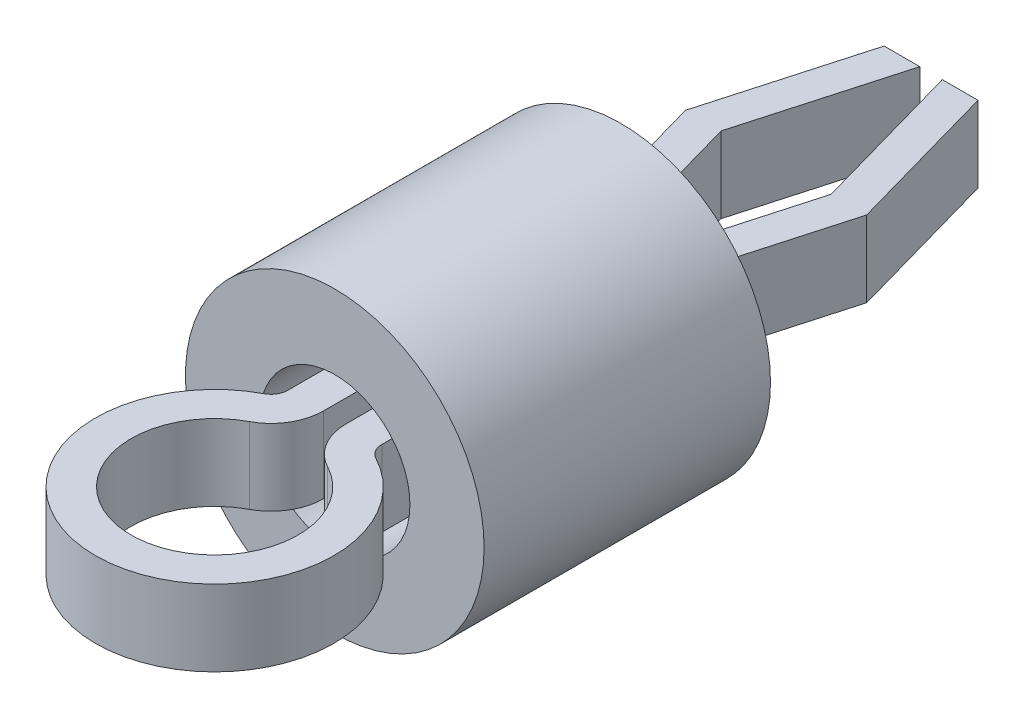
ISO-10303-21;
HEADER;
FILE_DESCRIPTION(('STEP AP214'),'2;1');
FILE_NAME('part.step','',(''),(''),'','','');
FILE_SCHEMA(('AUTOMOTIVE_DESIGN { 1 0 10303 214 1 1 1 1 }'));
ENDSEC;
DATA;
#1=APPLICATION_CONTEXT('core data for automotive mechanical design processes');
#2=APPLICATION_PROTOCOL_DEFINITION('international standard','automotive_design',2000,#1);
#3=PRODUCT_CONTEXT('',#1,'mechanical');
#4=PRODUCT('Part','Part','',(#3));
#5=PRODUCT_RELATED_PRODUCT_CATEGORY('part','',(#4));
#6=PRODUCT_DEFINITION_FORMATION('','',#4);
#7=PRODUCT_DEFINITION_CONTEXT('part definition',#1,'design');
#8=PRODUCT_DEFINITION('design','',#6,#7);
#9=PRODUCT_DEFINITION_SHAPE('','',#8);
#10=(LENGTH_UNIT() NAMED_UNIT(*) SI_UNIT(.MILLI.,.METRE.));
#11=(NAMED_UNIT(*) PLANE_ANGLE_UNIT() SI_UNIT($,.RADIAN.));
#12=(NAMED_UNIT(*) SI_UNIT($,.STERADIAN.) SOLID_ANGLE_UNIT());
#13=UNCERTAINTY_MEASURE_WITH_UNIT(LENGTH_MEASURE(1.E-05),#10,'distance_accuracy_value','');
#14=(GEOMETRIC_REPRESENTATION_CONTEXT(3) GLOBAL_UNCERTAINTY_ASSIGNED_CONTEXT((#13)) GLOBAL_UNIT_ASSIGNED_CONTEXT((#10,
#11,#12)) REPRESENTATION_CONTEXT('',''));
#15=CARTESIAN_POINT('',(0.,0.,0.));
#16=DIRECTION('',(0.,0.,1.));
#17=DIRECTION('',(1.,0.,0.));
#18=AXIS2_PLACEMENT_3D('',#15,#16,#17);
#19=CARTESIAN_POINT('',(0.,0.,3.05));
#20=DIRECTION('',(0.,0.,1.));
#21=DIRECTION('',(1.,0.,0.));
#22=AXIS2_PLACEMENT_3D('',#19,#20,#21);
#23=PLANE('',#22);
#24=CARTESIAN_POINT('',(0.,0.,3.05));
#25=DIRECTION('',(0.,0.,1.));
#26=DIRECTION('',(1.,0.,0.));
#27=AXIS2_PLACEMENT_3D('',#24,#25,#26);
#28=CIRCLE('',#27,0.8);
#29=CARTESIAN_POINT('',(0.8,0.,3.05));
#30=VERTEX_POINT('',#29);
#31=EDGE_CURVE('P0_E23',#30,#30,#28,.T.);
#32=ORIENTED_EDGE('',*,*,#31,.F.);
#33=EDGE_LOOP('',(#32));
#34=FACE_BOUND('',#33,.T.);
#35=CARTESIAN_POINT('',(0.,0.,3.05));
#36=DIRECTION('',(0.,0.,1.));
#37=DIRECTION('',(1.,0.,0.));
#38=AXIS2_PLACEMENT_3D('',#35,#36,#37);
#39=CIRCLE('',#38,1.59);
#40=CARTESIAN_POINT('',(1.59,0.,3.05));
#41=VERTEX_POINT('',#40);
#42=EDGE_CURVE('P0_E32',#41,#41,#39,.T.);
#43=ORIENTED_EDGE('',*,*,#42,.T.);
#44=EDGE_LOOP('',(#43));
#45=FACE_BOUND('',#44,.T.);
#46=ADVANCED_FACE('P0_F16',(#34,#45),#23,.T.);
#47=CARTESIAN_POINT('',(0.,0.,0.));
#48=DIRECTION('',(0.,0.,1.));
#49=DIRECTION('',(1.,0.,0.));
#50=AXIS2_PLACEMENT_3D('',#47,#48,#49);
#51=PLANE('',#50);
#52=CARTESIAN_POINT('',(0.,0.,0.));
#53=DIRECTION('',(0.,0.,1.));
#54=DIRECTION('',(1.,0.,0.));
#55=AXIS2_PLACEMENT_3D('',#52,#53,#54);
#56=CIRCLE('',#55,0.8);
#57=CARTESIAN_POINT('',(0.8,0.,0.));
#58=VERTEX_POINT('',#57);
#59=EDGE_CURVE('P0_E10',#58,#58,#56,.T.);
#60=ORIENTED_EDGE('',*,*,#59,.T.);
#61=EDGE_LOOP('',(#60));
#62=FACE_BOUND('',#61,.T.);
#63=CARTESIAN_POINT('',(0.,0.,0.));
#64=DIRECTION('',(0.,0.,1.));
#65=DIRECTION('',(1.,0.,0.));
#66=AXIS2_PLACEMENT_3D('',#63,#64,#65);
#67=CIRCLE('',#66,1.59);
#68=CARTESIAN_POINT('',(1.59,0.,0.));
#69=VERTEX_POINT('',#68);
#70=EDGE_CURVE('P0_E40',#69,#69,#67,.T.);
#71=ORIENTED_EDGE('',*,*,#70,.F.);
#72=EDGE_LOOP('',(#71));
#73=FACE_BOUND('',#72,.T.);
#74=ADVANCED_FACE('P0_F50',(#62,#73),#51,.F.);
#75=CARTESIAN_POINT('',(0.,0.,0.));
#76=DIRECTION('',(0.,0.,-1.));
#77=DIRECTION('',(1.,0.,0.));
#78=AXIS2_PLACEMENT_3D('',#75,#76,#77);
#79=CYLINDRICAL_SURFACE('',#78,0.8);
#80=ORIENTED_EDGE('',*,*,#31,.T.);
#81=EDGE_LOOP('',(#80));
#82=FACE_BOUND('',#81,.T.);
#83=ORIENTED_EDGE('',*,*,#59,.F.);
#84=EDGE_LOOP('',(#83));
#85=FACE_BOUND('',#84,.T.);
#86=ADVANCED_FACE('P0_F52',(#82,#85),#79,.F.);
#87=CARTESIAN_POINT('',(0.,0.,0.));
#88=DIRECTION('',(0.,0.,-1.));
#89=DIRECTION('',(1.,0.,0.));
#90=AXIS2_PLACEMENT_3D('',#87,#88,#89);
#91=CYLINDRICAL_SURFACE('',#90,1.59);
#92=ORIENTED_EDGE('',*,*,#42,.F.);
#93=EDGE_LOOP('',(#92));
#94=FACE_BOUND('',#93,.T.);
#95=ORIENTED_EDGE('',*,*,#70,.T.);
#96=EDGE_LOOP('',(#95));
#97=FACE_BOUND('',#96,.T.);
#98=ADVANCED_FACE('P0_F48',(#94,#97),#91,.T.);
#99=CLOSED_SHELL('',(#46,#74,#86,#98));
#100=MANIFOLD_SOLID_BREP('P0_B1',#99);
#101=CARTESIAN_POINT('',(-0.585000000021,-0.405,-1.65));
#102=DIRECTION('',(-0.96250827158784,0.,-0.271252331095955));
#103=DIRECTION('',(-0.271252331095955,0.,0.96250827158784));
#104=AXIS2_PLACEMENT_3D('',#101,#102,#103);
#105=PLANE('',#104);
#106=DIRECTION('',(0.,1.,0.));
#107=VECTOR('',#106,1.);
#108=CARTESIAN_POINT('',(-0.12,-0.405,-3.3));
#109=LINE('',#108,#107);
#110=CARTESIAN_POINT('',(-0.12,-0.405,-3.3));
#111=VERTEX_POINT('',#110);
#112=CARTESIAN_POINT('',(-0.12,0.405,-3.3));
#113=VERTEX_POINT('',#112);
#114=EDGE_CURVE('P1_E247',#111,#113,#109,.T.);
#115=ORIENTED_EDGE('',*,*,#114,.T.);
#116=DIRECTION('',(0.271252331095955,0.,-0.96250827158784));
#117=VECTOR('',#116,1.);
#118=CARTESIAN_POINT('',(-0.585000000021,0.405,-1.65));
#119=LINE('',#118,#117);
#120=CARTESIAN_POINT('',(-0.585000000021,0.405,-1.65));
#121=VERTEX_POINT('',#120);
#122=EDGE_CURVE('P1_E241',#121,#113,#119,.T.);
#123=ORIENTED_EDGE('',*,*,#122,.F.);
#124=DIRECTION('',(0.,1.,0.));
#125=VECTOR('',#124,1.);
#126=CARTESIAN_POINT('',(-0.585000000021,-0.405,-1.65));
#127=LINE('',#126,#125);
#128=CARTESIAN_POINT('',(-0.585000000021,-0.405,-1.65));
#129=VERTEX_POINT('',#128);
#130=EDGE_CURVE('P1_E408',#129,#121,#127,.T.);
#131=ORIENTED_EDGE('',*,*,#130,.F.);
#132=DIRECTION('',(0.271252331095955,0.,-0.96250827158784));
#133=VECTOR('',#132,1.);
#134=CARTESIAN_POINT('',(-0.585000000021,-0.405,-1.65));
#135=LINE('',#134,#133);
#136=EDGE_CURVE('P1_E11',#129,#111,#135,.T.);
#137=ORIENTED_EDGE('',*,*,#136,.T.);
#138=EDGE_LOOP('',(#115,#123,#131,#137));
#139=FACE_BOUND('',#138,.T.);
#140=ADVANCED_FACE('P1_F18',(#139),#105,.F.);
#141=CARTESIAN_POINT('',(-0.965000000021,0.405,-1.65));
#142=DIRECTION('',(0.96250827158784,0.,0.271252331095955));
#143=DIRECTION('',(0.,-1.,0.));
#144=AXIS2_PLACEMENT_3D('',#141,#142,#143);
#145=PLANE('',#144);
#146=DIRECTION('',(0.,-1.,0.));
#147=VECTOR('',#146,1.);
#148=CARTESIAN_POINT('',(-0.5,0.405,-3.3));
#149=LINE('',#148,#147);
#150=CARTESIAN_POINT('',(-0.5,0.405,-3.3));
#151=VERTEX_POINT('',#150);
#152=CARTESIAN_POINT('',(-0.5,-0.405,-3.3));
#153=VERTEX_POINT('',#152);
#154=EDGE_CURVE('P1_E22',#151,#153,#149,.T.);
#155=ORIENTED_EDGE('',*,*,#154,.T.);
#156=DIRECTION('',(0.271252331095955,0.,-0.96250827158784));
#157=VECTOR('',#156,1.);
#158=CARTESIAN_POINT('',(-0.965000000021,-0.405,-1.65));
#159=LINE('',#158,#157);
#160=CARTESIAN_POINT('',(-0.965000000021,-0.405,-1.65));
#161=VERTEX_POINT('',#160);
#162=EDGE_CURVE('P1_E28',#161,#153,#159,.T.);
#163=ORIENTED_EDGE('',*,*,#162,.F.);
#164=DIRECTION('',(0.,-1.,0.));
#165=VECTOR('',#164,1.);
#166=CARTESIAN_POINT('',(-0.965000000021,0.405,-1.65));
#167=LINE('',#166,#165);
#168=CARTESIAN_POINT('',(-0.965000000021,0.405,-1.65));
#169=VERTEX_POINT('',#168);
#170=EDGE_CURVE('P1_E252',#169,#161,#167,.T.);
#171=ORIENTED_EDGE('',*,*,#170,.F.);
#172=DIRECTION('',(0.271252331095955,0.,-0.96250827158784));
#173=VECTOR('',#172,1.);
#174=CARTESIAN_POINT('',(-0.965000000021,0.405,-1.65));
#175=LINE('',#174,#173);
#176=EDGE_CURVE('P1_E238',#169,#151,#175,.T.);
#177=ORIENTED_EDGE('',*,*,#176,.T.);
#178=EDGE_LOOP('',(#155,#163,#171,#177));
#179=FACE_BOUND('',#178,.T.);
#180=ADVANCED_FACE('P1_F20',(#179),#145,.F.);
#181=CARTESIAN_POINT('',(-0.31,0.,-3.3));
#182=DIRECTION('',(0.,0.,1.));
#183=DIRECTION('',(0.,-1.,0.));
#184=AXIS2_PLACEMENT_3D('',#181,#182,#183);
#185=PLANE('',#184);
#186=ORIENTED_EDGE('',*,*,#114,.F.);
#187=DIRECTION('',(1.,0.,0.));
#188=VECTOR('',#187,1.);
#189=CARTESIAN_POINT('',(-0.5,-0.405,-3.3));
#190=LINE('',#189,#188);
#191=EDGE_CURVE('P1_E436',#153,#111,#190,.T.);
#192=ORIENTED_EDGE('',*,*,#191,.F.);
#193=ORIENTED_EDGE('',*,*,#154,.F.);
#194=DIRECTION('',(-1.,0.,0.));
#195=VECTOR('',#194,1.);
#196=CARTESIAN_POINT('',(-0.12,0.405,-3.3));
#197=LINE('',#196,#195);
#198=EDGE_CURVE('P1_E242',#113,#151,#197,.T.);
#199=ORIENTED_EDGE('',*,*,#198,.F.);
#200=EDGE_LOOP('',(#186,#192,#193,#199));
#201=FACE_BOUND('',#200,.T.);
#202=ADVANCED_FACE('P1_F449',(#201),#185,.F.);
#203=CARTESIAN_POINT('',(-0.119999999957,-0.405,0.));
#204=DIRECTION('',(-0.96250827158132,0.,0.27125233111909));
#205=DIRECTION('',(0.,1.,0.));
#206=AXIS2_PLACEMENT_3D('',#203,#204,#205);
#207=PLANE('',#206);
#208=ORIENTED_EDGE('',*,*,#130,.T.);
#209=DIRECTION('',(-0.27125233111909,0.,-0.96250827158132));
#210=VECTOR('',#209,1.);
#211=CARTESIAN_POINT('',(-0.119999999957,0.405,0.));
#212=LINE('',#211,#210);
#213=CARTESIAN_POINT('',(-0.119999999957,0.405,0.));
#214=VERTEX_POINT('',#213);
#215=EDGE_CURVE('P1_E248',#214,#121,#212,.T.);
#216=ORIENTED_EDGE('',*,*,#215,.F.);
#217=DIRECTION('',(0.,1.,0.));
#218=VECTOR('',#217,1.);
#219=CARTESIAN_POINT('',(-0.119999999957,-0.405,0.));
#220=LINE('',#219,#218);
#221=CARTESIAN_POINT('',(-0.119999999957,-0.405,0.));
#222=VERTEX_POINT('',#221);
#223=EDGE_CURVE('P1_E419',#222,#214,#220,.T.);
#224=ORIENTED_EDGE('',*,*,#223,.F.);
#225=DIRECTION('',(-0.27125233111909,0.,-0.96250827158132));
#226=VECTOR('',#225,1.);
#227=CARTESIAN_POINT('',(-0.119999999957,-0.405,0.));
#228=LINE('',#227,#226);
#229=EDGE_CURVE('P1_E263',#222,#129,#228,.T.);
#230=ORIENTED_EDGE('',*,*,#229,.T.);
#231=EDGE_LOOP('',(#208,#216,#224,#230));
#232=FACE_BOUND('',#231,.T.);
#233=ADVANCED_FACE('P1_F452',(#232),#207,.F.);
#234=CARTESIAN_POINT('',(-0.499999999957,0.405,0.));
#235=DIRECTION('',(0.96250827158132,0.,-0.27125233111909));
#236=DIRECTION('',(0.,-1.,0.));
#237=AXIS2_PLACEMENT_3D('',#234,#235,#236);
#238=PLANE('',#237);
#239=ORIENTED_EDGE('',*,*,#170,.T.);
#240=DIRECTION('',(-0.27125233111909,0.,-0.96250827158132));
#241=VECTOR('',#240,1.);
#242=CARTESIAN_POINT('',(-0.499999999957,-0.405,0.));
#243=LINE('',#242,#241);
#244=CARTESIAN_POINT('',(-0.499999999957,-0.405,0.));
#245=VERTEX_POINT('',#244);
#246=EDGE_CURVE('P1_E260',#245,#161,#243,.T.);
#247=ORIENTED_EDGE('',*,*,#246,.F.);
#248=DIRECTION('',(0.,-1.,0.));
#249=VECTOR('',#248,1.);
#250=CARTESIAN_POINT('',(-0.499999999957,0.405,0.));
#251=LINE('',#250,#249);
#252=CARTESIAN_POINT('',(-0.499999999957,0.405,0.));
#253=VERTEX_POINT('',#252);
#254=EDGE_CURVE('P1_E356',#253,#245,#251,.T.);
#255=ORIENTED_EDGE('',*,*,#254,.F.);
#256=DIRECTION('',(-0.27125233111909,0.,-0.96250827158132));
#257=VECTOR('',#256,1.);
#258=CARTESIAN_POINT('',(-0.499999999957,0.405,0.));
#259=LINE('',#258,#257);
#260=EDGE_CURVE('P1_E253',#253,#169,#259,.T.);
#261=ORIENTED_EDGE('',*,*,#260,.T.);
#262=EDGE_LOOP('',(#239,#247,#255,#261));
#263=FACE_BOUND('',#262,.T.);
#264=ADVANCED_FACE('P1_F493',(#263),#238,.F.);
#265=CARTESIAN_POINT('',(-0.119999999957,-0.405,3.05));
#266=DIRECTION('',(-1.,0.,0.));
#267=DIRECTION('',(0.,0.,1.));
#268=AXIS2_PLACEMENT_3D('',#265,#266,#267);
#269=PLANE('',#268);
#270=ORIENTED_EDGE('',*,*,#223,.T.);
#271=DIRECTION('',(0.,0.,-1.));
#272=VECTOR('',#271,1.);
#273=CARTESIAN_POINT('',(-0.119999999957,0.405,3.05));
#274=LINE('',#273,#272);
#275=CARTESIAN_POINT('',(-0.119999999957,0.405,3.05));
#276=VERTEX_POINT('',#275);
#277=EDGE_CURVE('P1_E361',#276,#214,#274,.T.);
#278=ORIENTED_EDGE('',*,*,#277,.F.);
#279=DIRECTION('',(0.,1.,0.));
#280=VECTOR('',#279,1.);
#281=CARTESIAN_POINT('',(-0.119999999957,-0.405,3.05));
#282=LINE('',#281,#280);
#283=CARTESIAN_POINT('',(-0.119999999957,-0.405,3.05));
#284=VERTEX_POINT('',#283);
#285=EDGE_CURVE('P1_E266',#284,#276,#282,.T.);
#286=ORIENTED_EDGE('',*,*,#285,.F.);
#287=DIRECTION('',(0.,0.,-1.));
#288=VECTOR('',#287,1.);
#289=CARTESIAN_POINT('',(-0.119999999957,-0.405,3.05));
#290=LINE('',#289,#288);
#291=EDGE_CURVE('P1_E415',#284,#222,#290,.T.);
#292=ORIENTED_EDGE('',*,*,#291,.T.);
#293=EDGE_LOOP('',(#270,#278,#286,#292));
#294=FACE_BOUND('',#293,.T.);
#295=ADVANCED_FACE('P1_F454',(#294),#269,.F.);
#296=CARTESIAN_POINT('',(-0.499999999957,0.405,3.05));
#297=DIRECTION('',(1.,0.,0.));
#298=DIRECTION('',(0.,-1.,0.));
#299=AXIS2_PLACEMENT_3D('',#296,#297,#298);
#300=PLANE('',#299);
#301=ORIENTED_EDGE('',*,*,#254,.T.);
#302=DIRECTION('',(0.,0.,-1.));
#303=VECTOR('',#302,1.);
#304=CARTESIAN_POINT('',(-0.499999999957,-0.405,3.05));
#305=LINE('',#304,#303);
#306=CARTESIAN_POINT('',(-0.499999999957,-0.405,3.05));
#307=VERTEX_POINT('',#306);
#308=EDGE_CURVE('P1_E360',#307,#245,#305,.T.);
#309=ORIENTED_EDGE('',*,*,#308,.F.);
#310=DIRECTION('',(0.,1.,0.));
#311=VECTOR('',#310,1.);
#312=CARTESIAN_POINT('',(-0.499999999957,0.405,3.05));
#313=LINE('',#312,#311);
#314=CARTESIAN_POINT('',(-0.499999999957,0.405,3.05));
#315=VERTEX_POINT('',#314);
#316=EDGE_CURVE('P1_E313',#307,#315,#313,.T.);
#317=ORIENTED_EDGE('',*,*,#316,.T.);
#318=DIRECTION('',(0.,0.,-1.));
#319=VECTOR('',#318,1.);
#320=CARTESIAN_POINT('',(-0.499999999957,0.405,3.05));
#321=LINE('',#320,#319);
#322=EDGE_CURVE('P1_E270',#315,#253,#321,.T.);
#323=ORIENTED_EDGE('',*,*,#322,.T.);
#324=EDGE_LOOP('',(#301,#309,#317,#323));
#325=FACE_BOUND('',#324,.T.);
#326=ADVANCED_FACE('P1_F490',(#325),#300,.F.);
#327=CARTESIAN_POINT('',(-0.678896103815,-0.405,3.05));
#328=DIRECTION('',(0.,1.,0.));
#329=DIRECTION('',(1.,0.,0.));
#330=AXIS2_PLACEMENT_3D('',#327,#328,#329);
#331=CYLINDRICAL_SURFACE('',#330,0.558896103858);
#332=CARTESIAN_POINT('',(-0.678896103815,-0.405,3.05));
#333=DIRECTION('',(0.,1.,0.));
#334=DIRECTION('',(1.,0.,0.));
#335=AXIS2_PLACEMENT_3D('',#332,#333,#334);
#336=CIRCLE('',#335,0.558896103858);
#337=CARTESIAN_POINT('',(-0.417017241018,-0.405,3.543745193526));
#338=VERTEX_POINT('',#337);
#339=EDGE_CURVE('P1_E271',#338,#284,#336,.T.);
#340=ORIENTED_EDGE('',*,*,#339,.T.);
#341=ORIENTED_EDGE('',*,*,#285,.T.);
#342=CARTESIAN_POINT('',(-0.678896103815,0.405,3.05));
#343=DIRECTION('',(0.,1.,0.));
#344=DIRECTION('',(1.,0.,0.));
#345=AXIS2_PLACEMENT_3D('',#342,#343,#344);
#346=CIRCLE('',#345,0.558896103858);
#347=CARTESIAN_POINT('',(-0.417017241018,0.405,3.543745193526));
#348=VERTEX_POINT('',#347);
#349=EDGE_CURVE('P1_E254',#348,#276,#346,.T.);
#350=ORIENTED_EDGE('',*,*,#349,.F.);
#351=DIRECTION('',(0.,-1.,0.));
#352=VECTOR('',#351,1.);
#353=CARTESIAN_POINT('',(-0.417017241017,-0.405,3.543745193528));
#354=LINE('',#353,#352);
#355=EDGE_CURVE('P1_E259',#348,#338,#354,.T.);
#356=ORIENTED_EDGE('',*,*,#355,.T.);
#357=EDGE_LOOP('',(#340,#341,#350,#356));
#358=FACE_BOUND('',#357,.T.);
#359=ADVANCED_FACE('P1_F460',(#358),#331,.T.);
#360=CARTESIAN_POINT('',(-0.678896103815,0.405,3.05));
#361=DIRECTION('',(0.,1.,0.));
#362=DIRECTION('',(1.,0.,0.));
#363=AXIS2_PLACEMENT_3D('',#360,#361,#362);
#364=CYLINDRICAL_SURFACE('',#363,0.178896103858);
#365=ORIENTED_EDGE('',*,*,#316,.F.);
#366=CARTESIAN_POINT('',(-0.678896103815,-0.405,3.05));
#367=DIRECTION('',(0.,1.,0.));
#368=DIRECTION('',(1.,0.,0.));
#369=AXIS2_PLACEMENT_3D('',#366,#367,#368);
#370=CIRCLE('',#369,0.178896103858);
#371=CARTESIAN_POINT('',(-0.59507174377,-0.405,3.208042059716));
#372=VERTEX_POINT('',#371);
#373=EDGE_CURVE('P1_E369',#372,#307,#370,.T.);
#374=ORIENTED_EDGE('',*,*,#373,.F.);
#375=DIRECTION('',(0.,-1.,0.));
#376=VECTOR('',#375,1.);
#377=CARTESIAN_POINT('',(-0.595071743769,0.405,3.208042059718));
#378=LINE('',#377,#376);
#379=CARTESIAN_POINT('',(-0.59507174377,0.405,3.208042059716));
#380=VERTEX_POINT('',#379);
#381=EDGE_CURVE('P1_E384',#380,#372,#378,.T.);
#382=ORIENTED_EDGE('',*,*,#381,.F.);
#383=CARTESIAN_POINT('',(-0.678896103815,0.405,3.05));
#384=DIRECTION('',(0.,1.,0.));
#385=DIRECTION('',(1.,0.,0.));
#386=AXIS2_PLACEMENT_3D('',#383,#384,#385);
#387=CIRCLE('',#386,0.178896103858);
#388=EDGE_CURVE('P1_E258',#380,#315,#387,.T.);
#389=ORIENTED_EDGE('',*,*,#388,.T.);
#390=EDGE_LOOP('',(#365,#374,#382,#389));
#391=FACE_BOUND('',#390,.T.);
#392=ADVANCED_FACE('P1_F488',(#391),#364,.F.);
#393=CARTESIAN_POINT('',(0.,-0.405,4.33));
#394=DIRECTION('',(0.,-1.,0.));
#395=DIRECTION('',(0.999999999999337,0.,1.15165460588339E-06));
#396=AXIS2_PLACEMENT_3D('',#393,#394,#395);
#397=CYLINDRICAL_SURFACE('',#396,0.890000000003);
#398=ORIENTED_EDGE('',*,*,#355,.F.);
#399=CARTESIAN_POINT('',(0.,0.405,4.33));
#400=DIRECTION('',(0.,-1.,0.));
#401=DIRECTION('',(0.999999999999337,0.,1.15165460588339E-06));
#402=AXIS2_PLACEMENT_3D('',#399,#400,#401);
#403=CIRCLE('',#402,0.890000000003);
#404=CARTESIAN_POINT('',(0.417020131915,0.405,3.543746726822));
#405=VERTEX_POINT('',#404);
#406=EDGE_CURVE('P1_E373',#405,#348,#403,.T.);
#407=ORIENTED_EDGE('',*,*,#406,.F.);
#408=DIRECTION('',(0.,1.,0.));
#409=VECTOR('',#408,1.);
#410=CARTESIAN_POINT('',(0.417020131915,-0.405,3.543746726822));
#411=LINE('',#410,#409);
#412=CARTESIAN_POINT('',(0.417020131915,-0.405,3.543746726822));
#413=VERTEX_POINT('',#412);
#414=EDGE_CURVE('P1_E365',#413,#405,#411,.T.);
#415=ORIENTED_EDGE('',*,*,#414,.F.);
#416=CARTESIAN_POINT('',(0.,-0.405,4.33));
#417=DIRECTION('',(0.,-1.,0.));
#418=DIRECTION('',(0.999999999999337,0.,1.15165460588339E-06));
#419=AXIS2_PLACEMENT_3D('',#416,#417,#418);
#420=CIRCLE('',#419,0.890000000003);
#421=EDGE_CURVE('P1_E392',#413,#338,#420,.T.);
#422=ORIENTED_EDGE('',*,*,#421,.T.);
#423=EDGE_LOOP('',(#398,#407,#415,#422));
#424=FACE_BOUND('',#423,.T.);
#425=ADVANCED_FACE('P1_F462',(#424),#397,.F.);
#426=CARTESIAN_POINT('',(0.,0.405,4.33));
#427=DIRECTION('',(0.,-1.,0.));
#428=DIRECTION('',(0.999999999999674,0.,-8.07065038772237E-07));
#429=AXIS2_PLACEMENT_3D('',#426,#427,#428);
#430=CYLINDRICAL_SURFACE('',#429,1.269999999998);
#431=CARTESIAN_POINT('',(0.,0.405,4.33));
#432=DIRECTION('',(0.,-1.,0.));
#433=DIRECTION('',(0.999999999999674,0.,-8.07065038772237E-07));
#434=AXIS2_PLACEMENT_3D('',#431,#432,#433);
#435=CIRCLE('',#434,1.269999999998);
#436=CARTESIAN_POINT('',(0.595071473781,0.405,3.20804191652));
#437=VERTEX_POINT('',#436);
#438=EDGE_CURVE('P1_E377',#437,#380,#435,.T.);
#439=ORIENTED_EDGE('',*,*,#438,.T.);
#440=ORIENTED_EDGE('',*,*,#381,.T.);
#441=CARTESIAN_POINT('',(0.,-0.405,4.33));
#442=DIRECTION('',(0.,-1.,0.));
#443=DIRECTION('',(0.999999999999674,0.,-8.07065038772237E-07));
#444=AXIS2_PLACEMENT_3D('',#441,#442,#443);
#445=CIRCLE('',#444,1.269999999998);
#446=CARTESIAN_POINT('',(0.595071473781,-0.405,3.20804191652));
#447=VERTEX_POINT('',#446);
#448=EDGE_CURVE('P1_E388',#447,#372,#445,.T.);
#449=ORIENTED_EDGE('',*,*,#448,.F.);
#450=DIRECTION('',(0.,1.,0.));
#451=VECTOR('',#450,1.);
#452=CARTESIAN_POINT('',(0.595071473781,0.405,3.20804191652));
#453=LINE('',#452,#451);
#454=EDGE_CURVE('P1_E305',#447,#437,#453,.T.);
#455=ORIENTED_EDGE('',*,*,#454,.T.);
#456=EDGE_LOOP('',(#439,#440,#449,#455));
#457=FACE_BOUND('',#456,.T.);
#458=ADVANCED_FACE('P1_F484',(#457),#430,.T.);
#459=CARTESIAN_POINT('',(0.678896103815,-0.405,3.05));
#460=DIRECTION('',(0.,1.,0.));
#461=DIRECTION('',(0.999999999998318,0.,-1.83392332164758E-06));
#462=AXIS2_PLACEMENT_3D('',#459,#460,#461);
#463=CYLINDRICAL_SURFACE('',#462,0.558896103856);
#464=CARTESIAN_POINT('',(0.678896103815,-0.405,3.05));
#465=DIRECTION('',(0.,1.,0.));
#466=DIRECTION('',(0.999999999998318,0.,-1.83392332164758E-06));
#467=AXIS2_PLACEMENT_3D('',#464,#465,#466);
#468=CIRCLE('',#467,0.558896103856);
#469=CARTESIAN_POINT('',(0.11999999996,-0.405,3.050001024973));
#470=VERTEX_POINT('',#469);
#471=EDGE_CURVE('P1_E304',#470,#413,#468,.T.);
#472=ORIENTED_EDGE('',*,*,#471,.T.);
#473=ORIENTED_EDGE('',*,*,#414,.T.);
#474=CARTESIAN_POINT('',(0.678896103815,0.405,3.05));
#475=DIRECTION('',(0.,1.,0.));
#476=DIRECTION('',(0.999999999998318,0.,-1.83392332164758E-06));
#477=AXIS2_PLACEMENT_3D('',#474,#475,#476);
#478=CIRCLE('',#477,0.558896103856);
#479=CARTESIAN_POINT('',(0.11999999996,0.405,3.050001024973));
#480=VERTEX_POINT('',#479);
#481=EDGE_CURVE('P1_E349',#480,#405,#478,.T.);
#482=ORIENTED_EDGE('',*,*,#481,.F.);
#483=DIRECTION('',(0.,1.,0.));
#484=VECTOR('',#483,1.);
#485=CARTESIAN_POINT('',(0.11999999996,-0.405,3.050001024973));
#486=LINE('',#485,#484);
#487=EDGE_CURVE('P1_E345',#470,#480,#486,.T.);
#488=ORIENTED_EDGE('',*,*,#487,.F.);
#489=EDGE_LOOP('',(#472,#473,#482,#488));
#490=FACE_BOUND('',#489,.T.);
#491=ADVANCED_FACE('P1_F465',(#490),#463,.T.);
#492=CARTESIAN_POINT('',(0.678896103815,0.405,3.05));
#493=DIRECTION('',(0.,1.,0.));
#494=DIRECTION('',(0.999999999983587,0.,5.72942941238463E-06));
#495=AXIS2_PLACEMENT_3D('',#492,#493,#494);
#496=CYLINDRICAL_SURFACE('',#495,0.178896103864);
#497=ORIENTED_EDGE('',*,*,#454,.F.);
#498=CARTESIAN_POINT('',(0.678896103815,-0.405,3.05));
#499=DIRECTION('',(0.,1.,0.));
#500=DIRECTION('',(0.999999999983587,0.,5.72942941238463E-06));
#501=AXIS2_PLACEMENT_3D('',#498,#499,#500);
#502=CIRCLE('',#501,0.178896103864);
#503=CARTESIAN_POINT('',(0.499999999954,-0.405,3.049998975027));
#504=VERTEX_POINT('',#503);
#505=EDGE_CURVE('P1_E300',#504,#447,#502,.T.);
#506=ORIENTED_EDGE('',*,*,#505,.F.);
#507=DIRECTION('',(0.,-1.,0.));
#508=VECTOR('',#507,1.);
#509=CARTESIAN_POINT('',(0.499999999954,0.405,3.049998975027));
#510=LINE('',#509,#508);
#511=CARTESIAN_POINT('',(0.499999999954,0.405,3.049998975027));
#512=VERTEX_POINT('',#511);
#513=EDGE_CURVE('P1_E284',#512,#504,#510,.T.);
#514=ORIENTED_EDGE('',*,*,#513,.F.);
#515=CARTESIAN_POINT('',(0.678896103815,0.405,3.05));
#516=DIRECTION('',(0.,1.,0.));
#517=DIRECTION('',(0.999999999983587,0.,5.72942941238463E-06));
#518=AXIS2_PLACEMENT_3D('',#515,#516,#517);
#519=CIRCLE('',#518,0.178896103864);
#520=EDGE_CURVE('P1_E331',#512,#437,#519,.T.);
#521=ORIENTED_EDGE('',*,*,#520,.T.);
#522=EDGE_LOOP('',(#497,#506,#514,#521));
#523=FACE_BOUND('',#522,.T.);
#524=ADVANCED_FACE('P1_F482',(#523),#496,.F.);
#525=CARTESIAN_POINT('',(0.11999999996,-0.405,3.050001024973));
#526=DIRECTION('',(1.,0.,0.));
#527=DIRECTION('',(0.,1.,0.));
#528=AXIS2_PLACEMENT_3D('',#525,#526,#527);
#529=PLANE('',#528);
#530=ORIENTED_EDGE('',*,*,#487,.T.);
#531=DIRECTION('',(0.,0.,1.));
#532=VECTOR('',#531,1.);
#533=CARTESIAN_POINT('',(0.11999999996,0.405,3.050001024973));
#534=LINE('',#533,#532);
#535=CARTESIAN_POINT('',(0.11999999996,0.405,1.024972598795E-06));
#536=VERTEX_POINT('',#535);
#537=EDGE_CURVE('P1_E335',#536,#480,#534,.T.);
#538=ORIENTED_EDGE('',*,*,#537,.F.);
#539=DIRECTION('',(0.,1.,0.));
#540=VECTOR('',#539,1.);
#541=CARTESIAN_POINT('',(0.11999999996,-0.405,1.02497259924E-06));
#542=LINE('',#541,#540);
#543=CARTESIAN_POINT('',(0.11999999996,-0.405,1.02497259924E-06));
#544=VERTEX_POINT('',#543);
#545=EDGE_CURVE('P1_E323',#544,#536,#542,.T.);
#546=ORIENTED_EDGE('',*,*,#545,.F.);
#547=DIRECTION('',(0.,0.,1.));
#548=VECTOR('',#547,1.);
#549=CARTESIAN_POINT('',(0.11999999996,-0.405,3.050001024973));
#550=LINE('',#549,#548);
#551=EDGE_CURVE('P1_E283',#544,#470,#550,.T.);
#552=ORIENTED_EDGE('',*,*,#551,.T.);
#553=EDGE_LOOP('',(#530,#538,#546,#552));
#554=FACE_BOUND('',#553,.T.);
#555=ADVANCED_FACE('P1_F468',(#554),#529,.F.);
#556=CARTESIAN_POINT('',(0.499999999954,0.405,3.049998975027));
#557=DIRECTION('',(-1.,0.,0.));
#558=DIRECTION('',(0.,1.,0.));
#559=AXIS2_PLACEMENT_3D('',#556,#557,#558);
#560=PLANE('',#559);
#561=ORIENTED_EDGE('',*,*,#513,.T.);
#562=DIRECTION('',(0.,0.,1.));
#563=VECTOR('',#562,1.);
#564=CARTESIAN_POINT('',(0.499999999954,-0.405,3.049998975027));
#565=LINE('',#564,#563);
#566=CARTESIAN_POINT('',(0.499999999954,-0.405,-1.024972598795E-06));
#567=VERTEX_POINT('',#566);
#568=EDGE_CURVE('P1_E280',#567,#504,#565,.T.);
#569=ORIENTED_EDGE('',*,*,#568,.F.);
#570=DIRECTION('',(0.,-1.,0.));
#571=VECTOR('',#570,1.);
#572=CARTESIAN_POINT('',(0.499999999954,0.405,-1.02497259924E-06));
#573=LINE('',#572,#571);
#574=CARTESIAN_POINT('',(0.499999999954,0.405,-1.02497259924E-06));
#575=VERTEX_POINT('',#574);
#576=EDGE_CURVE('P1_E291',#575,#567,#573,.T.);
#577=ORIENTED_EDGE('',*,*,#576,.F.);
#578=DIRECTION('',(0.,0.,1.));
#579=VECTOR('',#578,1.);
#580=CARTESIAN_POINT('',(0.499999999954,0.405,3.049998975027));
#581=LINE('',#580,#579);
#582=EDGE_CURVE('P1_E327',#575,#512,#581,.T.);
#583=ORIENTED_EDGE('',*,*,#582,.T.);
#584=EDGE_LOOP('',(#561,#569,#577,#583));
#585=FACE_BOUND('',#584,.T.);
#586=ADVANCED_FACE('P1_F480',(#585),#560,.F.);
#587=CARTESIAN_POINT('',(0.11999999996,-0.405,1.02497259924E-06));
#588=DIRECTION('',(0.962508271587579,0.,0.271252331096881));
#589=DIRECTION('',(0.,-1.,0.));
#590=AXIS2_PLACEMENT_3D('',#587,#588,#589);
#591=PLANE('',#590);
#592=ORIENTED_EDGE('',*,*,#545,.T.);
#593=DIRECTION('',(-0.271252331096881,0.,0.962508271587579));
#594=VECTOR('',#593,1.);
#595=CARTESIAN_POINT('',(0.11999999996,0.405,1.024972598795E-06));
#596=LINE('',#595,#594);
#597=CARTESIAN_POINT('',(0.584999999982,0.405,-1.649998975027));
#598=VERTEX_POINT('',#597);
#599=EDGE_CURVE('P1_E290',#598,#536,#596,.T.);
#600=ORIENTED_EDGE('',*,*,#599,.F.);
#601=DIRECTION('',(0.,1.,0.));
#602=VECTOR('',#601,1.);
#603=CARTESIAN_POINT('',(0.584999999982,-0.405,-1.649998975027));
#604=LINE('',#603,#602);
#605=CARTESIAN_POINT('',(0.584999999982,-0.405,-1.649998975027));
#606=VERTEX_POINT('',#605);
#607=EDGE_CURVE('P1_E209',#606,#598,#604,.T.);
#608=ORIENTED_EDGE('',*,*,#607,.F.);
#609=DIRECTION('',(-0.271252331096881,0.,0.962508271587579));
#610=VECTOR('',#609,1.);
#611=CARTESIAN_POINT('',(0.11999999996,-0.405,1.024972599684E-06));
#612=LINE('',#611,#610);
#613=EDGE_CURVE('P1_E319',#606,#544,#612,.T.);
#614=ORIENTED_EDGE('',*,*,#613,.T.);
#615=EDGE_LOOP('',(#592,#600,#608,#614));
#616=FACE_BOUND('',#615,.T.);
#617=ADVANCED_FACE('P1_F470',(#616),#591,.F.);
#618=CARTESIAN_POINT('',(0.499999999954,0.405,-1.02497259924E-06));
#619=DIRECTION('',(-0.962508271587579,0.,-0.271252331096881));
#620=DIRECTION('',(-0.271252331096881,0.,0.962508271587579));
#621=AXIS2_PLACEMENT_3D('',#618,#619,#620);
#622=PLANE('',#621);
#623=ORIENTED_EDGE('',*,*,#576,.T.);
#624=DIRECTION('',(-0.271252331096881,0.,0.962508271587579));
#625=VECTOR('',#624,1.);
#626=CARTESIAN_POINT('',(0.499999999954,-0.405,-1.024972598795E-06));
#627=LINE('',#626,#625);
#628=CARTESIAN_POINT('',(0.964999999976,-0.405,-1.650001024973));
#629=VERTEX_POINT('',#628);
#630=EDGE_CURVE('P1_E295',#629,#567,#627,.T.);
#631=ORIENTED_EDGE('',*,*,#630,.F.);
#632=DIRECTION('',(0.,-1.,0.));
#633=VECTOR('',#632,1.);
#634=CARTESIAN_POINT('',(0.964999999976,0.405,-1.650001024973));
#635=LINE('',#634,#633);
#636=CARTESIAN_POINT('',(0.964999999976,0.405,-1.650001024973));
#637=VERTEX_POINT('',#636);
#638=EDGE_CURVE('P1_E214',#637,#629,#635,.T.);
#639=ORIENTED_EDGE('',*,*,#638,.F.);
#640=DIRECTION('',(-0.271252331096881,0.,0.962508271587579));
#641=VECTOR('',#640,1.);
#642=CARTESIAN_POINT('',(0.499999999954,0.405,-1.024972599684E-06));
#643=LINE('',#642,#641);
#644=EDGE_CURVE('P1_E286',#637,#575,#643,.T.);
#645=ORIENTED_EDGE('',*,*,#644,.T.);
#646=EDGE_LOOP('',(#623,#631,#639,#645));
#647=FACE_BOUND('',#646,.T.);
#648=ADVANCED_FACE('P1_F475',(#647),#622,.F.);
#649=CARTESIAN_POINT('',(0.584999999982,-0.405,-1.649998975027));
#650=DIRECTION('',(0.962508271594286,0.,-0.27125233107308));
#651=DIRECTION('',(0.,-1.,0.));
#652=AXIS2_PLACEMENT_3D('',#649,#650,#651);
#653=PLANE('',#652);
#654=ORIENTED_EDGE('',*,*,#607,.T.);
#655=DIRECTION('',(0.27125233107308,0.,0.962508271594286));
#656=VECTOR('',#655,1.);
#657=CARTESIAN_POINT('',(0.584999999982,0.405,-1.649998975027));
#658=LINE('',#657,#656);
#659=CARTESIAN_POINT('',(0.120000000003,0.405,-3.299998975027));
#660=VERTEX_POINT('',#659);
#661=EDGE_CURVE('P1_E202',#660,#598,#658,.T.);
#662=ORIENTED_EDGE('',*,*,#661,.F.);
#663=DIRECTION('',(0.,1.,0.));
#664=VECTOR('',#663,1.);
#665=CARTESIAN_POINT('',(0.120000000003,-0.405,-3.299998975027));
#666=LINE('',#665,#664);
#667=CARTESIAN_POINT('',(0.120000000003,-0.405,-3.299998975027));
#668=VERTEX_POINT('',#667);
#669=EDGE_CURVE('P1_E206',#668,#660,#666,.T.);
#670=ORIENTED_EDGE('',*,*,#669,.F.);
#671=DIRECTION('',(0.27125233107308,0.,0.962508271594286));
#672=VECTOR('',#671,1.);
#673=CARTESIAN_POINT('',(0.584999999982,-0.405,-1.649998975027));
#674=LINE('',#673,#672);
#675=EDGE_CURVE('P1_E299',#668,#606,#674,.T.);
#676=ORIENTED_EDGE('',*,*,#675,.T.);
#677=EDGE_LOOP('',(#654,#662,#670,#676));
#678=FACE_BOUND('',#677,.T.);
#679=ADVANCED_FACE('P1_F204',(#678),#653,.F.);
#680=CARTESIAN_POINT('',(0.542499999989,-0.405,-2.475));
#681=DIRECTION('',(0.,1.,0.));
#682=DIRECTION('',(0.,0.,-1.));
#683=AXIS2_PLACEMENT_3D('',#680,#681,#682);
#684=PLANE('',#683);
#685=DIRECTION('',(0.27125233107308,0.,0.962508271594286));
#686=VECTOR('',#685,1.);
#687=CARTESIAN_POINT('',(0.964999999976,-0.405,-1.650001024973));
#688=LINE('',#687,#686);
#689=CARTESIAN_POINT('',(0.499999999997,-0.405,-3.300001024973));
#690=VERTEX_POINT('',#689);
#691=EDGE_CURVE('P1_E277',#690,#629,#688,.T.);
#692=ORIENTED_EDGE('',*,*,#691,.T.);
#693=ORIENTED_EDGE('',*,*,#630,.T.);
#694=ORIENTED_EDGE('',*,*,#568,.T.);
#695=ORIENTED_EDGE('',*,*,#505,.T.);
#696=ORIENTED_EDGE('',*,*,#448,.T.);
#697=ORIENTED_EDGE('',*,*,#373,.T.);
#698=ORIENTED_EDGE('',*,*,#308,.T.);
#699=ORIENTED_EDGE('',*,*,#246,.T.);
#700=ORIENTED_EDGE('',*,*,#162,.T.);
#701=ORIENTED_EDGE('',*,*,#191,.T.);
#702=ORIENTED_EDGE('',*,*,#136,.F.);
#703=ORIENTED_EDGE('',*,*,#229,.F.);
#704=ORIENTED_EDGE('',*,*,#291,.F.);
#705=ORIENTED_EDGE('',*,*,#339,.F.);
#706=ORIENTED_EDGE('',*,*,#421,.F.);
#707=ORIENTED_EDGE('',*,*,#471,.F.);
#708=ORIENTED_EDGE('',*,*,#551,.F.);
#709=ORIENTED_EDGE('',*,*,#613,.F.);
#710=ORIENTED_EDGE('',*,*,#675,.F.);
#711=DIRECTION('',(-0.999999999985449,0.,5.39459262733242E-06));
#712=VECTOR('',#711,1.);
#713=CARTESIAN_POINT('',(0.499999999997,-0.405,-3.300001024973));
#714=LINE('',#713,#712);
#715=EDGE_CURVE('P1_E223',#690,#668,#714,.T.);
#716=ORIENTED_EDGE('',*,*,#715,.F.);
#717=EDGE_LOOP('',(#692,#693,#694,#695,#696,#697,#698,#699,#700,#701,#702,#703,#704,#705,#706,
#707,#708,#709,#710,#716));
#718=FACE_BOUND('',#717,.T.);
#719=ADVANCED_FACE('P1_F456',(#718),#684,.F.);
#720=CARTESIAN_POINT('',(0.964999999976,0.405,-1.650001024973));
#721=DIRECTION('',(-0.962508271594286,0.,0.27125233107308));
#722=DIRECTION('',(0.,1.,0.));
#723=AXIS2_PLACEMENT_3D('',#720,#721,#722);
#724=PLANE('',#723);
#725=ORIENTED_EDGE('',*,*,#638,.T.);
#726=ORIENTED_EDGE('',*,*,#691,.F.);
#727=DIRECTION('',(0.,-1.,0.));
#728=VECTOR('',#727,1.);
#729=CARTESIAN_POINT('',(0.499999999997,0.405,-3.300001024973));
#730=LINE('',#729,#728);
#731=CARTESIAN_POINT('',(0.499999999997,0.405,-3.300001024973));
#732=VERTEX_POINT('',#731);
#733=EDGE_CURVE('P1_E230',#732,#690,#730,.T.);
#734=ORIENTED_EDGE('',*,*,#733,.F.);
#735=DIRECTION('',(0.27125233107308,0.,0.962508271594286));
#736=VECTOR('',#735,1.);
#737=CARTESIAN_POINT('',(0.964999999976,0.405,-1.650001024973));
#738=LINE('',#737,#736);
#739=EDGE_CURVE('P1_E215',#732,#637,#738,.T.);
#740=ORIENTED_EDGE('',*,*,#739,.T.);
#741=EDGE_LOOP('',(#725,#726,#734,#740));
#742=FACE_BOUND('',#741,.T.);
#743=ADVANCED_FACE('P1_F472',(#742),#724,.F.);
#744=CARTESIAN_POINT('',(0.542499999989,0.405,-2.475));
#745=DIRECTION('',(0.,-1.,0.));
#746=DIRECTION('',(-1.,0.,0.));
#747=AXIS2_PLACEMENT_3D('',#744,#745,#746);
#748=PLANE('',#747);
#749=ORIENTED_EDGE('',*,*,#661,.T.);
#750=ORIENTED_EDGE('',*,*,#599,.T.);
#751=ORIENTED_EDGE('',*,*,#537,.T.);
#752=ORIENTED_EDGE('',*,*,#481,.T.);
#753=ORIENTED_EDGE('',*,*,#406,.T.);
#754=ORIENTED_EDGE('',*,*,#349,.T.);
#755=ORIENTED_EDGE('',*,*,#277,.T.);
#756=ORIENTED_EDGE('',*,*,#215,.T.);
#757=ORIENTED_EDGE('',*,*,#122,.T.);
#758=ORIENTED_EDGE('',*,*,#198,.T.);
#759=ORIENTED_EDGE('',*,*,#176,.F.);
#760=ORIENTED_EDGE('',*,*,#260,.F.);
#761=ORIENTED_EDGE('',*,*,#322,.F.);
#762=ORIENTED_EDGE('',*,*,#388,.F.);
#763=ORIENTED_EDGE('',*,*,#438,.F.);
#764=ORIENTED_EDGE('',*,*,#520,.F.);
#765=ORIENTED_EDGE('',*,*,#582,.F.);
#766=ORIENTED_EDGE('',*,*,#644,.F.);
#767=ORIENTED_EDGE('',*,*,#739,.F.);
#768=DIRECTION('',(0.999999999985449,0.,-5.39459262733242E-06));
#769=VECTOR('',#768,1.);
#770=CARTESIAN_POINT('',(0.120000000003,0.405,-3.299998975027));
#771=LINE('',#770,#769);
#772=EDGE_CURVE('P1_E221',#660,#732,#771,.T.);
#773=ORIENTED_EDGE('',*,*,#772,.F.);
#774=EDGE_LOOP('',(#749,#750,#751,#752,#753,#754,#755,#756,#757,#758,#759,#760,#761,#762,#763,
#764,#765,#766,#767,#773));
#775=FACE_BOUND('',#774,.T.);
#776=ADVANCED_FACE('P1_F226',(#775),#748,.F.);
#777=CARTESIAN_POINT('',(0.31,0.,-3.3));
#778=DIRECTION('',(-5.39459262731742E-06,0.,-0.999999999985449));
#779=DIRECTION('',(-0.999999999985449,0.,5.39459262731742E-06));
#780=AXIS2_PLACEMENT_3D('',#777,#778,#779);
#781=PLANE('',#780);
#782=ORIENTED_EDGE('',*,*,#772,.T.);
#783=ORIENTED_EDGE('',*,*,#733,.T.);
#784=ORIENTED_EDGE('',*,*,#715,.T.);
#785=ORIENTED_EDGE('',*,*,#669,.T.);
#786=EDGE_LOOP('',(#782,#783,#784,#785));
#787=FACE_BOUND('',#786,.T.);
#788=ADVANCED_FACE('P1_F219',(#787),#781,.T.);
#789=CLOSED_SHELL('',(#140,#180,#202,#233,#264,#295,#326,#359,#392,#425,#458,#491,#524,#555,
#586,#617,#648,#679,#719,#743,#776,#788));
#790=MANIFOLD_SOLID_BREP('P1_B1',#789);
#791=ADVANCED_BREP_SHAPE_REPRESENTATION('',(#18,#100,#790),#14);
#792=SHAPE_DEFINITION_REPRESENTATION(#9,#791);
ENDSEC;
END-ISO-10303-21;
